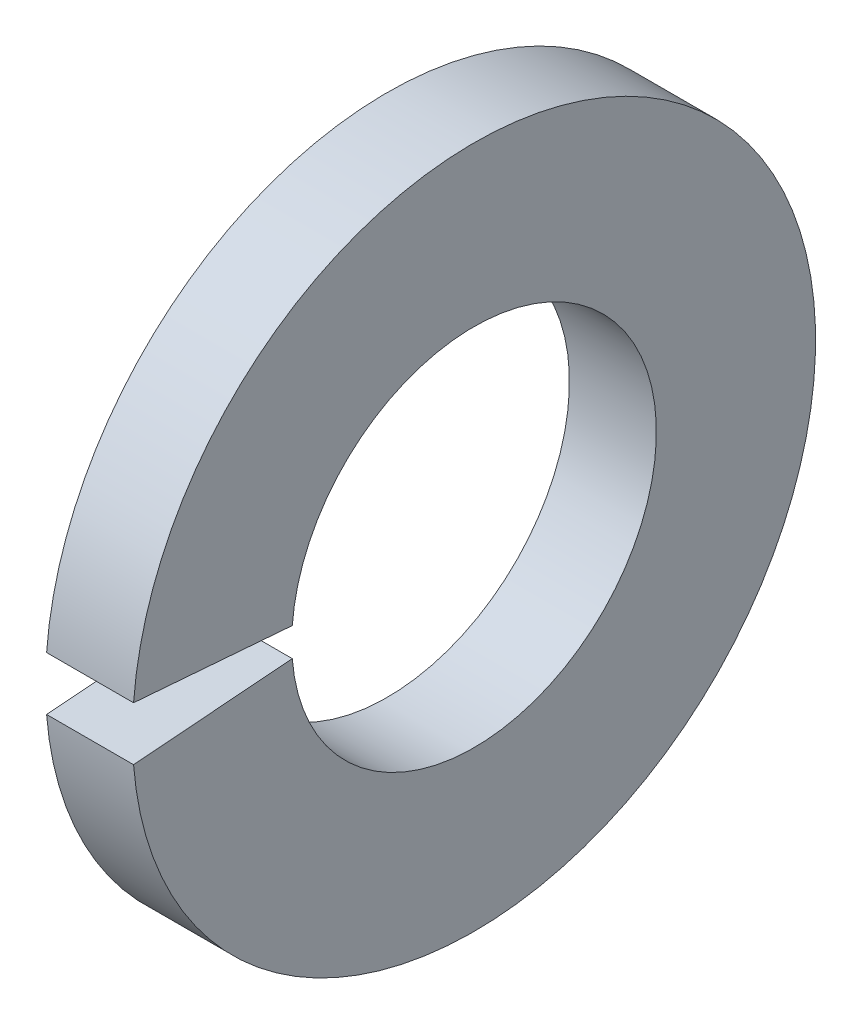
ISO-10303-21;
HEADER;
FILE_DESCRIPTION(('STEP AP214'),'2;1');
FILE_NAME('part.step','',(''),(''),'','','');
FILE_SCHEMA(('AUTOMOTIVE_DESIGN { 1 0 10303 214 1 1 1 1 }'));
ENDSEC;
DATA;
#1=APPLICATION_CONTEXT('core data for automotive mechanical design processes');
#2=APPLICATION_PROTOCOL_DEFINITION('international standard','automotive_design',2000,#1);
#3=PRODUCT_CONTEXT('',#1,'mechanical');
#4=PRODUCT('Part','Part','',(#3));
#5=PRODUCT_RELATED_PRODUCT_CATEGORY('part','',(#4));
#6=PRODUCT_DEFINITION_FORMATION('','',#4);
#7=PRODUCT_DEFINITION_CONTEXT('part definition',#1,'design');
#8=PRODUCT_DEFINITION('design','',#6,#7);
#9=PRODUCT_DEFINITION_SHAPE('','',#8);
#10=(LENGTH_UNIT() NAMED_UNIT(*) SI_UNIT(.MILLI.,.METRE.));
#11=(NAMED_UNIT(*) PLANE_ANGLE_UNIT() SI_UNIT($,.RADIAN.));
#12=(NAMED_UNIT(*) SI_UNIT($,.STERADIAN.) SOLID_ANGLE_UNIT());
#13=UNCERTAINTY_MEASURE_WITH_UNIT(LENGTH_MEASURE(1.E-05),#10,'distance_accuracy_value','');
#14=(GEOMETRIC_REPRESENTATION_CONTEXT(3) GLOBAL_UNCERTAINTY_ASSIGNED_CONTEXT((#13)) GLOBAL_UNIT_ASSIGNED_CONTEXT((#10,
#11,#12)) REPRESENTATION_CONTEXT('',''));
#15=CARTESIAN_POINT('',(0.,0.,0.));
#16=DIRECTION('',(0.,0.,1.));
#17=DIRECTION('',(1.,0.,0.));
#18=AXIS2_PLACEMENT_3D('',#15,#16,#17);
#19=CARTESIAN_POINT('',(-1.5748,0.259071934093342,3.29182103598679));
#20=DIRECTION('',(-1.,0.,0.));
#21=DIRECTION('',(0.,0.,1.));
#22=AXIS2_PLACEMENT_3D('',#19,#20,#21);
#23=PLANE('',#22);
#24=CARTESIAN_POINT('',(-1.5748,0.,0.));
#25=DIRECTION('',(-1.,0.,0.));
#26=DIRECTION('',(0.,0.,1.));
#27=AXIS2_PLACEMENT_3D('',#24,#25,#26);
#28=CIRCLE('',#27,3.302);
#29=CARTESIAN_POINT('',(-1.5748,0.259071934093342,3.29182103598679));
#30=VERTEX_POINT('',#29);
#31=CARTESIAN_POINT('',(-1.5748,-0.259071934093346,3.29182103598679));
#32=VERTEX_POINT('',#31);
#33=EDGE_CURVE('E34',#30,#32,#28,.T.);
#34=ORIENTED_EDGE('',*,*,#33,.F.);
#35=DIRECTION('',(0.,0.0784590957278445,0.996917333733128));
#36=VECTOR('',#35,1.);
#37=CARTESIAN_POINT('',(-1.5748,0.259071934093342,3.29182103598679));
#38=LINE('',#37,#36);
#39=CARTESIAN_POINT('',(-1.5748,0.485261661167145,6.16583401740602));
#40=VERTEX_POINT('',#39);
#41=EDGE_CURVE('E10',#30,#40,#38,.T.);
#42=ORIENTED_EDGE('',*,*,#41,.T.);
#43=CARTESIAN_POINT('',(-1.5748,0.,0.));
#44=DIRECTION('',(-1.,0.,0.));
#45=DIRECTION('',(0.,0.,1.));
#46=AXIS2_PLACEMENT_3D('',#43,#44,#45);
#47=CIRCLE('',#46,6.1849);
#48=CARTESIAN_POINT('',(-1.5748,-0.485261661167152,6.16583401740602));
#49=VERTEX_POINT('',#48);
#50=EDGE_CURVE('E26',#40,#49,#47,.T.);
#51=ORIENTED_EDGE('',*,*,#50,.T.);
#52=DIRECTION('',(0.,-0.0784590957278456,0.996917333733128));
#53=VECTOR('',#52,1.);
#54=CARTESIAN_POINT('',(-1.5748,-0.259071934093346,3.29182103598679));
#55=LINE('',#54,#53);
#56=EDGE_CURVE('E72',#32,#49,#55,.T.);
#57=ORIENTED_EDGE('',*,*,#56,.F.);
#58=EDGE_LOOP('',(#34,#42,#51,#57));
#59=FACE_BOUND('',#58,.T.);
#60=ADVANCED_FACE('F16',(#59),#23,.T.);
#61=CARTESIAN_POINT('',(0.,0.,0.));
#62=DIRECTION('',(-1.,0.,0.));
#63=DIRECTION('',(0.,0.,1.));
#64=AXIS2_PLACEMENT_3D('',#61,#62,#63);
#65=CYLINDRICAL_SURFACE('',#64,3.302);
#66=CARTESIAN_POINT('',(0.,0.,0.));
#67=DIRECTION('',(-1.,0.,0.));
#68=DIRECTION('',(0.,0.,1.));
#69=AXIS2_PLACEMENT_3D('',#66,#67,#68);
#70=CIRCLE('',#69,3.302);
#71=CARTESIAN_POINT('',(0.,0.259071934093342,3.29182103598679));
#72=VERTEX_POINT('',#71);
#73=CARTESIAN_POINT('',(0.,-0.259071934093346,3.29182103598679));
#74=VERTEX_POINT('',#73);
#75=EDGE_CURVE('E61',#72,#74,#70,.T.);
#76=ORIENTED_EDGE('',*,*,#75,.F.);
#77=DIRECTION('',(-1.,0.,0.));
#78=VECTOR('',#77,1.);
#79=CARTESIAN_POINT('',(0.,0.259071934093342,3.29182103598679));
#80=LINE('',#79,#78);
#81=EDGE_CURVE('E81',#72,#30,#80,.T.);
#82=ORIENTED_EDGE('',*,*,#81,.T.);
#83=ORIENTED_EDGE('',*,*,#33,.T.);
#84=DIRECTION('',(-1.,0.,0.));
#85=VECTOR('',#84,1.);
#86=CARTESIAN_POINT('',(0.,-0.259071934093346,3.29182103598679));
#87=LINE('',#86,#85);
#88=EDGE_CURVE('E65',#74,#32,#87,.T.);
#89=ORIENTED_EDGE('',*,*,#88,.F.);
#90=EDGE_LOOP('',(#76,#82,#83,#89));
#91=FACE_BOUND('',#90,.T.);
#92=ADVANCED_FACE('F87',(#91),#65,.F.);
#93=CARTESIAN_POINT('',(0.,0.485261661167145,6.16583401740602));
#94=DIRECTION('',(1.,0.,0.));
#95=DIRECTION('',(0.,0.,-1.));
#96=AXIS2_PLACEMENT_3D('',#93,#94,#95);
#97=PLANE('',#96);
#98=CARTESIAN_POINT('',(0.,0.,0.));
#99=DIRECTION('',(-1.,0.,0.));
#100=DIRECTION('',(0.,0.,1.));
#101=AXIS2_PLACEMENT_3D('',#98,#99,#100);
#102=CIRCLE('',#101,6.1849);
#103=CARTESIAN_POINT('',(0.,0.485261661167145,6.16583401740602));
#104=VERTEX_POINT('',#103);
#105=CARTESIAN_POINT('',(0.,-0.485261661167152,6.16583401740602));
#106=VERTEX_POINT('',#105);
#107=EDGE_CURVE('E55',#104,#106,#102,.T.);
#108=ORIENTED_EDGE('',*,*,#107,.F.);
#109=DIRECTION('',(0.,-0.0784590957278445,-0.996917333733128));
#110=VECTOR('',#109,1.);
#111=CARTESIAN_POINT('',(0.,0.485261661167145,6.16583401740602));
#112=LINE('',#111,#110);
#113=EDGE_CURVE('E80',#104,#72,#112,.T.);
#114=ORIENTED_EDGE('',*,*,#113,.T.);
#115=ORIENTED_EDGE('',*,*,#75,.T.);
#116=DIRECTION('',(0.,0.0784590957278456,-0.996917333733128));
#117=VECTOR('',#116,1.);
#118=CARTESIAN_POINT('',(0.,-0.485261661167152,6.16583401740602));
#119=LINE('',#118,#117);
#120=EDGE_CURVE('E59',#106,#74,#119,.T.);
#121=ORIENTED_EDGE('',*,*,#120,.F.);
#122=EDGE_LOOP('',(#108,#114,#115,#121));
#123=FACE_BOUND('',#122,.T.);
#124=ADVANCED_FACE('F60',(#123),#97,.T.);
#125=CARTESIAN_POINT('',(0.,0.,0.));
#126=DIRECTION('',(-1.,0.,0.));
#127=DIRECTION('',(0.,0.,1.));
#128=AXIS2_PLACEMENT_3D('',#125,#126,#127);
#129=CYLINDRICAL_SURFACE('',#128,6.1849);
#130=DIRECTION('',(1.,0.,0.));
#131=VECTOR('',#130,1.);
#132=CARTESIAN_POINT('',(-1.5748,0.485261661167145,6.16583401740602));
#133=LINE('',#132,#131);
#134=EDGE_CURVE('E71',#40,#104,#133,.T.);
#135=ORIENTED_EDGE('',*,*,#134,.T.);
#136=ORIENTED_EDGE('',*,*,#107,.T.);
#137=DIRECTION('',(1.,0.,0.));
#138=VECTOR('',#137,1.);
#139=CARTESIAN_POINT('',(-1.5748,-0.485261661167152,6.16583401740602));
#140=LINE('',#139,#138);
#141=EDGE_CURVE('E20',#49,#106,#140,.T.);
#142=ORIENTED_EDGE('',*,*,#141,.F.);
#143=ORIENTED_EDGE('',*,*,#50,.F.);
#144=EDGE_LOOP('',(#135,#136,#142,#143));
#145=FACE_BOUND('',#144,.T.);
#146=ADVANCED_FACE('F18',(#145),#129,.T.);
#147=CARTESIAN_POINT('',(0.,0.,0.));
#148=DIRECTION('',(0.,0.996917333733128,-0.0784590957278445));
#149=DIRECTION('',(0.,0.0784590957278445,0.996917333733128));
#150=AXIS2_PLACEMENT_3D('',#147,#148,#149);
#151=PLANE('',#150);
#152=ORIENTED_EDGE('',*,*,#41,.F.);
#153=ORIENTED_EDGE('',*,*,#81,.F.);
#154=ORIENTED_EDGE('',*,*,#113,.F.);
#155=ORIENTED_EDGE('',*,*,#134,.F.);
#156=EDGE_LOOP('',(#152,#153,#154,#155));
#157=FACE_BOUND('',#156,.T.);
#158=ADVANCED_FACE('F90',(#157),#151,.F.);
#159=CARTESIAN_POINT('',(0.,0.,0.));
#160=DIRECTION('',(0.,0.996917333733128,0.0784590957278457));
#161=DIRECTION('',(0.,-0.0784590957278457,0.996917333733128));
#162=AXIS2_PLACEMENT_3D('',#159,#160,#161);
#163=PLANE('',#162);
#164=ORIENTED_EDGE('',*,*,#56,.T.);
#165=ORIENTED_EDGE('',*,*,#141,.T.);
#166=ORIENTED_EDGE('',*,*,#120,.T.);
#167=ORIENTED_EDGE('',*,*,#88,.T.);
#168=EDGE_LOOP('',(#164,#165,#166,#167));
#169=FACE_BOUND('',#168,.T.);
#170=ADVANCED_FACE('F74',(#169),#163,.T.);
#171=CLOSED_SHELL('',(#60,#92,#124,#146,#158,#170));
#172=MANIFOLD_SOLID_BREP('B1',#171);
#173=ADVANCED_BREP_SHAPE_REPRESENTATION('',(#18,#172),#14);
#174=SHAPE_DEFINITION_REPRESENTATION(#9,#173);
ENDSEC;
END-ISO-10303-21;
